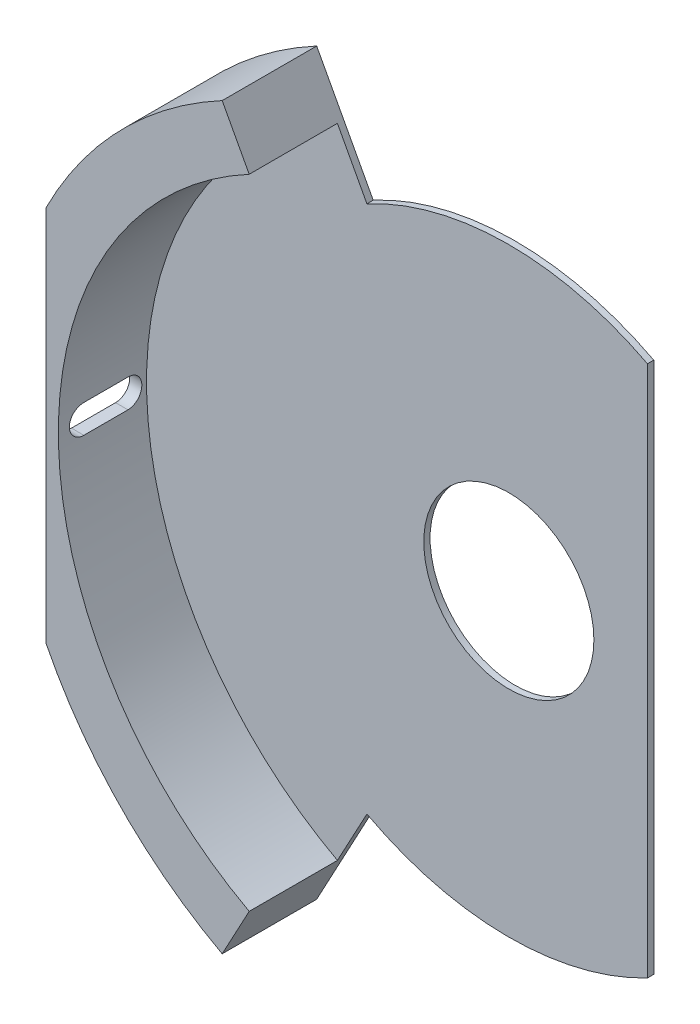
ISO-10303-21;
HEADER;
FILE_DESCRIPTION(('STEP AP214'),'2;1');
FILE_NAME('part.step','',(''),(''),'','','');
FILE_SCHEMA(('AUTOMOTIVE_DESIGN { 1 0 10303 214 1 1 1 1 }'));
ENDSEC;
DATA;
#1=APPLICATION_CONTEXT('core data for automotive mechanical design processes');
#2=APPLICATION_PROTOCOL_DEFINITION('international standard','automotive_design',2000,#1);
#3=PRODUCT_CONTEXT('',#1,'mechanical');
#4=PRODUCT('Part','Part','',(#3));
#5=PRODUCT_RELATED_PRODUCT_CATEGORY('part','',(#4));
#6=PRODUCT_DEFINITION_FORMATION('','',#4);
#7=PRODUCT_DEFINITION_CONTEXT('part definition',#1,'design');
#8=PRODUCT_DEFINITION('design','',#6,#7);
#9=PRODUCT_DEFINITION_SHAPE('','',#8);
#10=(LENGTH_UNIT() NAMED_UNIT(*) SI_UNIT(.MILLI.,.METRE.));
#11=(NAMED_UNIT(*) PLANE_ANGLE_UNIT() SI_UNIT($,.RADIAN.));
#12=(NAMED_UNIT(*) SI_UNIT($,.STERADIAN.) SOLID_ANGLE_UNIT());
#13=UNCERTAINTY_MEASURE_WITH_UNIT(LENGTH_MEASURE(1.E-05),#10,'distance_accuracy_value','');
#14=(GEOMETRIC_REPRESENTATION_CONTEXT(3) GLOBAL_UNCERTAINTY_ASSIGNED_CONTEXT((#13)) GLOBAL_UNIT_ASSIGNED_CONTEXT((#10,
#11,#12)) REPRESENTATION_CONTEXT('',''));
#15=CARTESIAN_POINT('',(0.,0.,0.));
#16=DIRECTION('',(0.,0.,1.));
#17=DIRECTION('',(1.,0.,0.));
#18=AXIS2_PLACEMENT_3D('',#15,#16,#17);
#19=CARTESIAN_POINT('',(0.,0.,1.));
#20=DIRECTION('',(0.,0.,1.));
#21=DIRECTION('',(1.,0.,0.));
#22=AXIS2_PLACEMENT_3D('',#19,#20,#21);
#23=PLANE('',#22);
#24=CARTESIAN_POINT('',(15.4943062439211,0.0942624622545622,1.));
#25=DIRECTION('',(0.,0.,1.));
#26=DIRECTION('',(1.,0.,0.));
#27=AXIS2_PLACEMENT_3D('',#24,#25,#26);
#28=CIRCLE('',#27,13.5);
#29=CARTESIAN_POINT('',(28.9943062439211,0.0942624622545622,1.));
#30=VERTEX_POINT('',#29);
#31=EDGE_CURVE('E277',#30,#30,#28,.T.);
#32=ORIENTED_EDGE('',*,*,#31,.F.);
#33=EDGE_LOOP('',(#32));
#34=FACE_BOUND('',#33,.T.);
#35=DIRECTION('',(0.473188405167526,-0.880961255229203,0.));
#36=VECTOR('',#35,1.);
#37=CARTESIAN_POINT('',(12.0643127935309,6.48007264374847,1.));
#38=LINE('',#37,#36);
#39=CARTESIAN_POINT('',(-11.7140270532117,50.7495346379337,1.));
#40=VERTEX_POINT('',#39);
#41=CARTESIAN_POINT('',(-7.03072274692771,42.0303657081212,1.));
#42=VERTEX_POINT('',#41);
#43=EDGE_CURVE('E303',#40,#42,#38,.T.);
#44=ORIENTED_EDGE('',*,*,#43,.F.);
#45=CARTESIAN_POINT('',(15.494306243921,0.0942624622545657,1.));
#46=DIRECTION('',(0.,0.,1.));
#47=DIRECTION('',(1.,0.,0.));
#48=AXIS2_PLACEMENT_3D('',#45,#46,#47);
#49=CIRCLE('',#48,57.5);
#50=CARTESIAN_POINT('',(-11.7140270532117,-50.5610097134247,1.));
#51=VERTEX_POINT('',#50);
#52=EDGE_CURVE('E189',#40,#51,#49,.T.);
#53=ORIENTED_EDGE('',*,*,#52,.T.);
#54=DIRECTION('',(0.473188405167525,0.880961255229204,0.));
#55=VECTOR('',#54,1.);
#56=CARTESIAN_POINT('',(11.9857241706994,-6.43786054318077,1.));
#57=LINE('',#56,#55);
#58=CARTESIAN_POINT('',(-7.0307227469277,-41.8418407836121,1.));
#59=VERTEX_POINT('',#58);
#60=EDGE_CURVE('E462',#51,#59,#57,.T.);
#61=ORIENTED_EDGE('',*,*,#60,.T.);
#62=CARTESIAN_POINT('',(15.4943062439211,0.0942624622545622,1.));
#63=DIRECTION('',(0.,0.,1.));
#64=DIRECTION('',(1.,0.,0.));
#65=AXIS2_PLACEMENT_3D('',#62,#63,#64);
#66=CIRCLE('',#65,47.6026646994321);
#67=CARTESIAN_POINT('',(37.494306243921,-42.1196414852195,1.));
#68=VERTEX_POINT('',#67);
#69=EDGE_CURVE('E478',#59,#68,#66,.T.);
#70=ORIENTED_EDGE('',*,*,#69,.T.);
#71=DIRECTION('',(0.,-1.,0.));
#72=VECTOR('',#71,1.);
#73=CARTESIAN_POINT('',(37.494306243921,0.,1.));
#74=LINE('',#73,#72);
#75=CARTESIAN_POINT('',(37.494306243921,42.3081664097286,1.));
#76=VERTEX_POINT('',#75);
#77=EDGE_CURVE('E361',#76,#68,#74,.T.);
#78=ORIENTED_EDGE('',*,*,#77,.F.);
#79=CARTESIAN_POINT('',(15.4943062439211,0.0942624622545622,1.));
#80=DIRECTION('',(0.,0.,1.));
#81=DIRECTION('',(1.,0.,0.));
#82=AXIS2_PLACEMENT_3D('',#79,#80,#81);
#83=CIRCLE('',#82,47.6026646994321);
#84=EDGE_CURVE('E292',#76,#42,#83,.T.);
#85=ORIENTED_EDGE('',*,*,#84,.T.);
#86=EDGE_LOOP('',(#44,#53,#61,#70,#78,#85));
#87=FACE_BOUND('',#86,.T.);
#88=ADVANCED_FACE('F35',(#34,#87),#23,.T.);
#89=CARTESIAN_POINT('',(0.,30.0942624622545,1.));
#90=DIRECTION('',(0.,1.,0.));
#91=DIRECTION('',(0.,0.,1.));
#92=AXIS2_PLACEMENT_3D('',#89,#90,#91);
#93=PLANE('',#92);
#94=DIRECTION('',(0.,0.,-1.));
#95=VECTOR('',#94,1.);
#96=CARTESIAN_POINT('',(-24.926493756079,30.0942624622545,1.));
#97=LINE('',#96,#95);
#98=CARTESIAN_POINT('',(-24.926493756079,30.0942624622545,0.));
#99=VERTEX_POINT('',#98);
#100=CARTESIAN_POINT('',(-24.926493756079,30.0942624622545,-7.));
#101=VERTEX_POINT('',#100);
#102=EDGE_CURVE('E11',#99,#101,#97,.T.);
#103=ORIENTED_EDGE('',*,*,#102,.F.);
#104=DIRECTION('',(1.,0.,0.));
#105=VECTOR('',#104,1.);
#106=CARTESIAN_POINT('',(0.,30.0942624622545,0.));
#107=LINE('',#106,#105);
#108=CARTESIAN_POINT('',(29.0043062439211,30.0942624622545,0.));
#109=VERTEX_POINT('',#108);
#110=EDGE_CURVE('E288',#99,#109,#107,.T.);
#111=ORIENTED_EDGE('',*,*,#110,.T.);
#112=DIRECTION('',(0.,0.,1.));
#113=VECTOR('',#112,1.);
#114=CARTESIAN_POINT('',(29.0043062439211,30.0942624622545,-7.));
#115=LINE('',#114,#113);
#116=CARTESIAN_POINT('',(29.0043062439211,30.0942624622545,-7.));
#117=VERTEX_POINT('',#116);
#118=EDGE_CURVE('E324',#117,#109,#115,.T.);
#119=ORIENTED_EDGE('',*,*,#118,.F.);
#120=DIRECTION('',(-1.,0.,0.));
#121=VECTOR('',#120,1.);
#122=CARTESIAN_POINT('',(0.,30.0942624622545,-7.));
#123=LINE('',#122,#121);
#124=EDGE_CURVE('E316',#117,#101,#123,.T.);
#125=ORIENTED_EDGE('',*,*,#124,.T.);
#126=EDGE_LOOP('',(#103,#111,#119,#125));
#127=FACE_BOUND('',#126,.T.);
#128=ADVANCED_FACE('F234',(#127),#93,.T.);
#129=CARTESIAN_POINT('',(-24.926493756079,0.,1.));
#130=DIRECTION('',(1.,0.,0.));
#131=DIRECTION('',(0.,0.,-1.));
#132=AXIS2_PLACEMENT_3D('',#129,#130,#131);
#133=PLANE('',#132);
#134=DIRECTION('',(0.,1.,0.));
#135=VECTOR('',#134,1.);
#136=CARTESIAN_POINT('',(-24.926493756079,0.,0.));
#137=LINE('',#136,#135);
#138=CARTESIAN_POINT('',(-24.926493756079,25.4942624622546,0.));
#139=VERTEX_POINT('',#138);
#140=EDGE_CURVE('E464',#139,#99,#137,.T.);
#141=ORIENTED_EDGE('',*,*,#140,.T.);
#142=ORIENTED_EDGE('',*,*,#102,.T.);
#143=DIRECTION('',(0.,-1.,0.));
#144=VECTOR('',#143,1.);
#145=CARTESIAN_POINT('',(-24.926493756079,0.,-7.));
#146=LINE('',#145,#144);
#147=CARTESIAN_POINT('',(-24.926493756079,25.4942624622546,-7.));
#148=VERTEX_POINT('',#147);
#149=EDGE_CURVE('E308',#101,#148,#146,.T.);
#150=ORIENTED_EDGE('',*,*,#149,.T.);
#151=DIRECTION('',(0.,0.,1.));
#152=VECTOR('',#151,1.);
#153=CARTESIAN_POINT('',(-24.926493756079,25.4942624622546,-7.));
#154=LINE('',#153,#152);
#155=EDGE_CURVE('E319',#148,#139,#154,.T.);
#156=ORIENTED_EDGE('',*,*,#155,.T.);
#157=EDGE_LOOP('',(#141,#142,#150,#156));
#158=FACE_BOUND('',#157,.T.);
#159=ADVANCED_FACE('F240',(#158),#133,.F.);
#160=CARTESIAN_POINT('',(-24.926493756079,-29.9057375377455,0.));
#161=VERTEX_POINT('',#160);
#162=CARTESIAN_POINT('',(-24.926493756079,-25.3057375377455,0.));
#163=VERTEX_POINT('',#162);
#164=EDGE_CURVE('E374',#161,#163,#137,.T.);
#165=ORIENTED_EDGE('',*,*,#164,.T.);
#166=DIRECTION('',(0.,0.,1.));
#167=VECTOR('',#166,1.);
#168=CARTESIAN_POINT('',(-24.926493756079,-25.3057375377455,-7.));
#169=LINE('',#168,#167);
#170=CARTESIAN_POINT('',(-24.926493756079,-25.3057375377455,-7.));
#171=VERTEX_POINT('',#170);
#172=EDGE_CURVE('E346',#171,#163,#169,.T.);
#173=ORIENTED_EDGE('',*,*,#172,.F.);
#174=DIRECTION('',(0.,-1.,0.));
#175=VECTOR('',#174,1.);
#176=CARTESIAN_POINT('',(-24.926493756079,0.,-7.));
#177=LINE('',#176,#175);
#178=CARTESIAN_POINT('',(-24.926493756079,-29.9057375377455,-7.));
#179=VERTEX_POINT('',#178);
#180=EDGE_CURVE('E336',#171,#179,#177,.T.);
#181=ORIENTED_EDGE('',*,*,#180,.T.);
#182=DIRECTION('',(0.,0.,-1.));
#183=VECTOR('',#182,1.);
#184=CARTESIAN_POINT('',(-24.926493756079,-29.9057375377455,1.));
#185=LINE('',#184,#183);
#186=EDGE_CURVE('E43',#161,#179,#185,.T.);
#187=ORIENTED_EDGE('',*,*,#186,.F.);
#188=EDGE_LOOP('',(#165,#173,#181,#187));
#189=FACE_BOUND('',#188,.T.);
#190=ADVANCED_FACE('F257',(#189),#133,.F.);
#191=CARTESIAN_POINT('',(0.,-29.9057375377455,1.));
#192=DIRECTION('',(0.,1.,0.));
#193=DIRECTION('',(0.,0.,1.));
#194=AXIS2_PLACEMENT_3D('',#191,#192,#193);
#195=PLANE('',#194);
#196=DIRECTION('',(-1.,0.,0.));
#197=VECTOR('',#196,1.);
#198=CARTESIAN_POINT('',(0.,-29.9057375377455,0.));
#199=LINE('',#198,#197);
#200=CARTESIAN_POINT('',(29.0043062439211,-29.9057375377455,0.));
#201=VERTEX_POINT('',#200);
#202=EDGE_CURVE('E368',#201,#161,#199,.T.);
#203=ORIENTED_EDGE('',*,*,#202,.T.);
#204=ORIENTED_EDGE('',*,*,#186,.T.);
#205=DIRECTION('',(1.,0.,0.));
#206=VECTOR('',#205,1.);
#207=CARTESIAN_POINT('',(0.,-29.9057375377455,-7.));
#208=LINE('',#207,#206);
#209=CARTESIAN_POINT('',(29.0043062439211,-29.9057375377455,-7.));
#210=VERTEX_POINT('',#209);
#211=EDGE_CURVE('E340',#179,#210,#208,.T.);
#212=ORIENTED_EDGE('',*,*,#211,.T.);
#213=DIRECTION('',(0.,0.,1.));
#214=VECTOR('',#213,1.);
#215=CARTESIAN_POINT('',(29.0043062439211,-29.9057375377455,-7.));
#216=LINE('',#215,#214);
#217=EDGE_CURVE('E354',#210,#201,#216,.T.);
#218=ORIENTED_EDGE('',*,*,#217,.T.);
#219=EDGE_LOOP('',(#203,#204,#212,#218));
#220=FACE_BOUND('',#219,.T.);
#221=ADVANCED_FACE('F253',(#220),#195,.F.);
#222=CARTESIAN_POINT('',(0.,0.,0.));
#223=DIRECTION('',(0.,0.,1.));
#224=DIRECTION('',(1.,0.,0.));
#225=AXIS2_PLACEMENT_3D('',#222,#223,#224);
#226=PLANE('',#225);
#227=CARTESIAN_POINT('',(15.4943062439211,0.0942624622545622,0.));
#228=DIRECTION('',(0.,0.,1.));
#229=DIRECTION('',(1.,0.,0.));
#230=AXIS2_PLACEMENT_3D('',#227,#228,#229);
#231=CIRCLE('',#230,47.6026646994321);
#232=CARTESIAN_POINT('',(-7.03072274692771,42.0303657081212,0.));
#233=VERTEX_POINT('',#232);
#234=CARTESIAN_POINT('',(37.494306243921,42.3081664097286,0.));
#235=VERTEX_POINT('',#234);
#236=EDGE_CURVE('E281',#233,#235,#231,.F.);
#237=ORIENTED_EDGE('',*,*,#236,.T.);
#238=DIRECTION('',(0.,-1.,0.));
#239=VECTOR('',#238,1.);
#240=CARTESIAN_POINT('',(37.494306243921,0.,0.));
#241=LINE('',#240,#239);
#242=CARTESIAN_POINT('',(37.494306243921,-42.1196414852195,0.));
#243=VERTEX_POINT('',#242);
#244=EDGE_CURVE('E269',#235,#243,#241,.T.);
#245=ORIENTED_EDGE('',*,*,#244,.T.);
#246=CARTESIAN_POINT('',(15.4943062439211,0.0942624622545622,0.));
#247=DIRECTION('',(0.,0.,1.));
#248=DIRECTION('',(1.,0.,0.));
#249=AXIS2_PLACEMENT_3D('',#246,#247,#248);
#250=CIRCLE('',#249,47.6026646994321);
#251=CARTESIAN_POINT('',(-7.0307227469277,-41.8418407836121,0.));
#252=VERTEX_POINT('',#251);
#253=EDGE_CURVE('E304',#243,#252,#250,.F.);
#254=ORIENTED_EDGE('',*,*,#253,.T.);
#255=DIRECTION('',(-0.473188405167525,-0.880961255229204,0.));
#256=VECTOR('',#255,1.);
#257=CARTESIAN_POINT('',(11.9857241706994,-6.43786054318077,0.));
#258=LINE('',#257,#256);
#259=CARTESIAN_POINT('',(-16.0032391306588,-58.5464751526176,0.));
#260=VERTEX_POINT('',#259);
#261=EDGE_CURVE('E307',#252,#260,#258,.T.);
#262=ORIENTED_EDGE('',*,*,#261,.T.);
#263=CARTESIAN_POINT('',(15.4943062439211,0.0942624622545622,0.));
#264=DIRECTION('',(0.,0.,1.));
#265=DIRECTION('',(1.,0.,0.));
#266=AXIS2_PLACEMENT_3D('',#263,#264,#265);
#267=CIRCLE('',#266,66.5644910792534);
#268=CARTESIAN_POINT('',(-43.926493756079,-29.9057375377455,0.));
#269=VERTEX_POINT('',#268);
#270=EDGE_CURVE('E473',#269,#260,#267,.T.);
#271=ORIENTED_EDGE('',*,*,#270,.F.);
#272=DIRECTION('',(0.,1.,0.));
#273=VECTOR('',#272,1.);
#274=CARTESIAN_POINT('',(-43.926493756079,0.,0.));
#275=LINE('',#274,#273);
#276=CARTESIAN_POINT('',(-43.926493756079,30.0942624622545,0.));
#277=VERTEX_POINT('',#276);
#278=EDGE_CURVE('E471',#269,#277,#275,.T.);
#279=ORIENTED_EDGE('',*,*,#278,.T.);
#280=CARTESIAN_POINT('',(15.4943062439211,0.0942624622545622,0.));
#281=DIRECTION('',(0.,0.,1.));
#282=DIRECTION('',(1.,0.,0.));
#283=AXIS2_PLACEMENT_3D('',#280,#281,#282);
#284=CIRCLE('',#283,66.5644910792534);
#285=CARTESIAN_POINT('',(-16.0032391306588,58.7350000771267,0.));
#286=VERTEX_POINT('',#285);
#287=EDGE_CURVE('E469',#277,#286,#284,.F.);
#288=ORIENTED_EDGE('',*,*,#287,.T.);
#289=DIRECTION('',(-0.473188405167526,0.880961255229203,0.));
#290=VECTOR('',#289,1.);
#291=CARTESIAN_POINT('',(12.0643127935309,6.48007264374847,0.));
#292=LINE('',#291,#290);
#293=EDGE_CURVE('E284',#233,#286,#292,.T.);
#294=ORIENTED_EDGE('',*,*,#293,.F.);
#295=EDGE_LOOP('',(#237,#245,#254,#262,#271,#279,#288,#294));
#296=FACE_BOUND('',#295,.T.);
#297=DIRECTION('',(-1.,0.,0.));
#298=VECTOR('',#297,1.);
#299=CARTESIAN_POINT('',(0.,-25.3057375377455,0.));
#300=LINE('',#299,#298);
#301=CARTESIAN_POINT('',(29.0043062439211,-25.3057375377454,0.));
#302=VERTEX_POINT('',#301);
#303=EDGE_CURVE('E327',#302,#163,#300,.T.);
#304=ORIENTED_EDGE('',*,*,#303,.T.);
#305=ORIENTED_EDGE('',*,*,#164,.F.);
#306=ORIENTED_EDGE('',*,*,#202,.F.);
#307=DIRECTION('',(0.,1.,0.));
#308=VECTOR('',#307,1.);
#309=CARTESIAN_POINT('',(29.0043062439211,0.,0.));
#310=LINE('',#309,#308);
#311=EDGE_CURVE('E337',#201,#302,#310,.T.);
#312=ORIENTED_EDGE('',*,*,#311,.T.);
#313=EDGE_LOOP('',(#304,#305,#306,#312));
#314=FACE_BOUND('',#313,.T.);
#315=CARTESIAN_POINT('',(15.4943062439211,0.0942624622545622,0.));
#316=DIRECTION('',(0.,0.,1.));
#317=DIRECTION('',(1.,0.,0.));
#318=AXIS2_PLACEMENT_3D('',#315,#316,#317);
#319=CIRCLE('',#318,13.5);
#320=CARTESIAN_POINT('',(28.9943062439211,0.0942624622545622,0.));
#321=VERTEX_POINT('',#320);
#322=EDGE_CURVE('E278',#321,#321,#319,.T.);
#323=ORIENTED_EDGE('',*,*,#322,.T.);
#324=EDGE_LOOP('',(#323));
#325=FACE_BOUND('',#324,.T.);
#326=DIRECTION('',(0.,-1.,0.));
#327=VECTOR('',#326,1.);
#328=CARTESIAN_POINT('',(29.0043062439211,0.,0.));
#329=LINE('',#328,#327);
#330=CARTESIAN_POINT('',(29.0043062439211,25.4942624622546,0.));
#331=VERTEX_POINT('',#330);
#332=EDGE_CURVE('E312',#109,#331,#329,.T.);
#333=ORIENTED_EDGE('',*,*,#332,.F.);
#334=ORIENTED_EDGE('',*,*,#110,.F.);
#335=ORIENTED_EDGE('',*,*,#140,.F.);
#336=DIRECTION('',(-1.,0.,0.));
#337=VECTOR('',#336,1.);
#338=CARTESIAN_POINT('',(0.,25.4942624622546,0.));
#339=LINE('',#338,#337);
#340=EDGE_CURVE('E306',#331,#139,#339,.T.);
#341=ORIENTED_EDGE('',*,*,#340,.F.);
#342=EDGE_LOOP('',(#333,#334,#335,#341));
#343=FACE_BOUND('',#342,.T.);
#344=ADVANCED_FACE('F249',(#296,#314,#325,#343),#226,.F.);
#345=CARTESIAN_POINT('',(37.494306243921,0.,1.));
#346=DIRECTION('',(1.,0.,0.));
#347=DIRECTION('',(0.,0.,-1.));
#348=AXIS2_PLACEMENT_3D('',#345,#346,#347);
#349=PLANE('',#348);
#350=ORIENTED_EDGE('',*,*,#244,.F.);
#351=DIRECTION('',(0.,0.,1.));
#352=VECTOR('',#351,1.);
#353=CARTESIAN_POINT('',(37.494306243921,42.3081664097286,-142.773565847131));
#354=LINE('',#353,#352);
#355=EDGE_CURVE('E272',#235,#76,#354,.T.);
#356=ORIENTED_EDGE('',*,*,#355,.T.);
#357=ORIENTED_EDGE('',*,*,#77,.T.);
#358=DIRECTION('',(0.,0.,1.));
#359=VECTOR('',#358,1.);
#360=CARTESIAN_POINT('',(37.494306243921,-42.1196414852195,-142.773565847131));
#361=LINE('',#360,#359);
#362=EDGE_CURVE('E275',#243,#68,#361,.T.);
#363=ORIENTED_EDGE('',*,*,#362,.F.);
#364=EDGE_LOOP('',(#350,#356,#357,#363));
#365=FACE_BOUND('',#364,.T.);
#366=ADVANCED_FACE('F252',(#365),#349,.T.);
#367=CARTESIAN_POINT('',(15.4943062439211,0.0942624622545622,1.));
#368=DIRECTION('',(0.,0.,-1.));
#369=DIRECTION('',(-1.,0.,0.));
#370=AXIS2_PLACEMENT_3D('',#367,#368,#369);
#371=CYLINDRICAL_SURFACE('',#370,13.5);
#372=ORIENTED_EDGE('',*,*,#31,.T.);
#373=EDGE_LOOP('',(#372));
#374=FACE_BOUND('',#373,.T.);
#375=ORIENTED_EDGE('',*,*,#322,.F.);
#376=EDGE_LOOP('',(#375));
#377=FACE_BOUND('',#376,.T.);
#378=ADVANCED_FACE('F37',(#374,#377),#371,.F.);
#379=CARTESIAN_POINT('',(0.,-25.3057375377455,-7.));
#380=DIRECTION('',(0.,1.,0.));
#381=DIRECTION('',(-1.,0.,0.));
#382=AXIS2_PLACEMENT_3D('',#379,#380,#381);
#383=PLANE('',#382);
#384=ORIENTED_EDGE('',*,*,#303,.F.);
#385=DIRECTION('',(0.,0.,1.));
#386=VECTOR('',#385,1.);
#387=CARTESIAN_POINT('',(29.0043062439211,-25.3057375377454,-7.));
#388=LINE('',#387,#386);
#389=CARTESIAN_POINT('',(29.0043062439211,-25.3057375377454,-7.));
#390=VERTEX_POINT('',#389);
#391=EDGE_CURVE('E351',#390,#302,#388,.T.);
#392=ORIENTED_EDGE('',*,*,#391,.F.);
#393=DIRECTION('',(-1.,0.,0.));
#394=VECTOR('',#393,1.);
#395=CARTESIAN_POINT('',(0.,-25.3057375377455,-7.));
#396=LINE('',#395,#394);
#397=EDGE_CURVE('E333',#390,#171,#396,.T.);
#398=ORIENTED_EDGE('',*,*,#397,.T.);
#399=ORIENTED_EDGE('',*,*,#172,.T.);
#400=EDGE_LOOP('',(#384,#392,#398,#399));
#401=FACE_BOUND('',#400,.T.);
#402=ADVANCED_FACE('F247',(#401),#383,.T.);
#403=CARTESIAN_POINT('',(29.0043062439211,0.,-7.));
#404=DIRECTION('',(1.,0.,0.));
#405=DIRECTION('',(0.,0.,-1.));
#406=AXIS2_PLACEMENT_3D('',#403,#404,#405);
#407=PLANE('',#406);
#408=ORIENTED_EDGE('',*,*,#311,.F.);
#409=ORIENTED_EDGE('',*,*,#217,.F.);
#410=DIRECTION('',(0.,1.,0.));
#411=VECTOR('',#410,1.);
#412=CARTESIAN_POINT('',(29.0043062439211,0.,-7.));
#413=LINE('',#412,#411);
#414=EDGE_CURVE('E343',#210,#390,#413,.T.);
#415=ORIENTED_EDGE('',*,*,#414,.T.);
#416=ORIENTED_EDGE('',*,*,#391,.T.);
#417=EDGE_LOOP('',(#408,#409,#415,#416));
#418=FACE_BOUND('',#417,.T.);
#419=ADVANCED_FACE('F379',(#418),#407,.T.);
#420=CARTESIAN_POINT('',(0.,0.,-7.));
#421=DIRECTION('',(0.,0.,1.));
#422=DIRECTION('',(1.,0.,0.));
#423=AXIS2_PLACEMENT_3D('',#420,#421,#422);
#424=PLANE('',#423);
#425=ORIENTED_EDGE('',*,*,#397,.F.);
#426=ORIENTED_EDGE('',*,*,#414,.F.);
#427=ORIENTED_EDGE('',*,*,#211,.F.);
#428=ORIENTED_EDGE('',*,*,#180,.F.);
#429=EDGE_LOOP('',(#425,#426,#427,#428));
#430=FACE_BOUND('',#429,.T.);
#431=ADVANCED_FACE('F373',(#430),#424,.F.);
#432=CARTESIAN_POINT('',(29.0043062439211,0.,-7.));
#433=DIRECTION('',(-1.,0.,0.));
#434=DIRECTION('',(0.,0.,1.));
#435=AXIS2_PLACEMENT_3D('',#432,#433,#434);
#436=PLANE('',#435);
#437=ORIENTED_EDGE('',*,*,#332,.T.);
#438=DIRECTION('',(0.,0.,1.));
#439=VECTOR('',#438,1.);
#440=CARTESIAN_POINT('',(29.0043062439211,25.4942624622546,-7.));
#441=LINE('',#440,#439);
#442=CARTESIAN_POINT('',(29.0043062439211,25.4942624622546,-7.));
#443=VERTEX_POINT('',#442);
#444=EDGE_CURVE('E328',#443,#331,#441,.T.);
#445=ORIENTED_EDGE('',*,*,#444,.F.);
#446=DIRECTION('',(0.,-1.,0.));
#447=VECTOR('',#446,1.);
#448=CARTESIAN_POINT('',(29.0043062439211,0.,-7.));
#449=LINE('',#448,#447);
#450=EDGE_CURVE('E314',#117,#443,#449,.T.);
#451=ORIENTED_EDGE('',*,*,#450,.F.);
#452=ORIENTED_EDGE('',*,*,#118,.T.);
#453=EDGE_LOOP('',(#437,#445,#451,#452));
#454=FACE_BOUND('',#453,.T.);
#455=ADVANCED_FACE('F385',(#454),#436,.F.);
#456=CARTESIAN_POINT('',(0.,25.4942624622546,-7.));
#457=DIRECTION('',(0.,1.,0.));
#458=DIRECTION('',(-1.,0.,0.));
#459=AXIS2_PLACEMENT_3D('',#456,#457,#458);
#460=PLANE('',#459);
#461=ORIENTED_EDGE('',*,*,#340,.T.);
#462=ORIENTED_EDGE('',*,*,#155,.F.);
#463=DIRECTION('',(-1.,0.,0.));
#464=VECTOR('',#463,1.);
#465=CARTESIAN_POINT('',(0.,25.4942624622546,-7.));
#466=LINE('',#465,#464);
#467=EDGE_CURVE('E311',#443,#148,#466,.T.);
#468=ORIENTED_EDGE('',*,*,#467,.F.);
#469=ORIENTED_EDGE('',*,*,#444,.T.);
#470=EDGE_LOOP('',(#461,#462,#468,#469));
#471=FACE_BOUND('',#470,.T.);
#472=ADVANCED_FACE('F388',(#471),#460,.F.);
#473=CARTESIAN_POINT('',(0.,0.,-7.));
#474=DIRECTION('',(0.,0.,-1.));
#475=DIRECTION('',(-1.,0.,0.));
#476=AXIS2_PLACEMENT_3D('',#473,#474,#475);
#477=PLANE('',#476);
#478=ORIENTED_EDGE('',*,*,#149,.F.);
#479=ORIENTED_EDGE('',*,*,#124,.F.);
#480=ORIENTED_EDGE('',*,*,#450,.T.);
#481=ORIENTED_EDGE('',*,*,#467,.T.);
#482=EDGE_LOOP('',(#478,#479,#480,#481));
#483=FACE_BOUND('',#482,.T.);
#484=ADVANCED_FACE('F391',(#483),#477,.T.);
#485=CARTESIAN_POINT('',(11.9857241706994,-6.43786054318077,-142.773565847131));
#486=DIRECTION('',(0.880961255229204,-0.473188405167525,0.));
#487=DIRECTION('',(0.473188405167525,0.880961255229204,0.));
#488=AXIS2_PLACEMENT_3D('',#485,#486,#487);
#489=PLANE('',#488);
#490=ORIENTED_EDGE('',*,*,#261,.F.);
#491=DIRECTION('',(0.,0.,1.));
#492=VECTOR('',#491,1.);
#493=CARTESIAN_POINT('',(-7.0307227469277,-41.8418407836121,-142.773565847131));
#494=LINE('',#493,#492);
#495=EDGE_CURVE('E297',#252,#59,#494,.T.);
#496=ORIENTED_EDGE('',*,*,#495,.T.);
#497=ORIENTED_EDGE('',*,*,#60,.F.);
#498=DIRECTION('',(0.,0.,-1.));
#499=VECTOR('',#498,1.);
#500=CARTESIAN_POINT('',(-11.7140270532117,-50.5610097134247,15.));
#501=LINE('',#500,#499);
#502=CARTESIAN_POINT('',(-11.7140270532117,-50.5610097134247,15.));
#503=VERTEX_POINT('',#502);
#504=EDGE_CURVE('E460',#503,#51,#501,.T.);
#505=ORIENTED_EDGE('',*,*,#504,.F.);
#506=DIRECTION('',(0.473188405167525,0.880961255229204,0.));
#507=VECTOR('',#506,1.);
#508=CARTESIAN_POINT('',(11.9857241706993,-6.43786054318075,15.));
#509=LINE('',#508,#507);
#510=CARTESIAN_POINT('',(-16.0032391306588,-58.5464751526176,15.));
#511=VERTEX_POINT('',#510);
#512=EDGE_CURVE('E452',#511,#503,#509,.T.);
#513=ORIENTED_EDGE('',*,*,#512,.F.);
#514=DIRECTION('',(0.,0.,1.));
#515=VECTOR('',#514,1.);
#516=CARTESIAN_POINT('',(-16.0032391306588,-58.5464751526176,-142.773565847131));
#517=LINE('',#516,#515);
#518=EDGE_CURVE('E465',#260,#511,#517,.T.);
#519=ORIENTED_EDGE('',*,*,#518,.F.);
#520=EDGE_LOOP('',(#490,#496,#497,#505,#513,#519));
#521=FACE_BOUND('',#520,.T.);
#522=ADVANCED_FACE('F398',(#521),#489,.T.);
#523=CARTESIAN_POINT('',(15.4943062439211,0.0942624622545622,-142.773565847131));
#524=DIRECTION('',(0.,0.,1.));
#525=DIRECTION('',(1.,0.,0.));
#526=AXIS2_PLACEMENT_3D('',#523,#524,#525);
#527=CYLINDRICAL_SURFACE('',#526,66.5644910792534);
#528=DIRECTION('',(0.,0.,1.));
#529=VECTOR('',#528,1.);
#530=CARTESIAN_POINT('',(-43.926493756079,-29.9057375377455,-142.773565847131));
#531=LINE('',#530,#529);
#532=CARTESIAN_POINT('',(-43.926493756079,-29.9057375377455,15.));
#533=VERTEX_POINT('',#532);
#534=EDGE_CURVE('E484',#269,#533,#531,.T.);
#535=ORIENTED_EDGE('',*,*,#534,.F.);
#536=ORIENTED_EDGE('',*,*,#270,.T.);
#537=ORIENTED_EDGE('',*,*,#518,.T.);
#538=CARTESIAN_POINT('',(15.494306243921,0.0942624622545657,15.));
#539=DIRECTION('',(0.,0.,1.));
#540=DIRECTION('',(1.,0.,0.));
#541=AXIS2_PLACEMENT_3D('',#538,#539,#540);
#542=CIRCLE('',#541,66.5644910792534);
#543=EDGE_CURVE('E446',#533,#511,#542,.T.);
#544=ORIENTED_EDGE('',*,*,#543,.F.);
#545=EDGE_LOOP('',(#535,#536,#537,#544));
#546=FACE_BOUND('',#545,.T.);
#547=ADVANCED_FACE('F402',(#546),#527,.T.);
#548=CARTESIAN_POINT('',(-43.926493756079,0.,-142.773565847131));
#549=DIRECTION('',(-1.,0.,0.));
#550=DIRECTION('',(0.,0.,1.));
#551=AXIS2_PLACEMENT_3D('',#548,#549,#550);
#552=PLANE('',#551);
#553=CARTESIAN_POINT('',(-43.926493756079,0.,4.));
#554=DIRECTION('',(-1.,0.,0.));
#555=DIRECTION('',(0.,0.,1.));
#556=AXIS2_PLACEMENT_3D('',#553,#554,#555);
#557=CIRCLE('',#556,2.25);
#558=CARTESIAN_POINT('',(-43.926493756079,2.25,4.));
#559=VERTEX_POINT('',#558);
#560=CARTESIAN_POINT('',(-43.926493756079,-2.25,4.));
#561=VERTEX_POINT('',#560);
#562=EDGE_CURVE('E50',#559,#561,#557,.T.);
#563=ORIENTED_EDGE('',*,*,#562,.F.);
#564=DIRECTION('',(0.,0.,-1.));
#565=VECTOR('',#564,1.);
#566=CARTESIAN_POINT('',(-43.926493756079,2.25,4.));
#567=LINE('',#566,#565);
#568=CARTESIAN_POINT('',(-43.926493756079,2.25,11.));
#569=VERTEX_POINT('',#568);
#570=EDGE_CURVE('E195',#569,#559,#567,.T.);
#571=ORIENTED_EDGE('',*,*,#570,.F.);
#572=CARTESIAN_POINT('',(-43.926493756079,0.,11.));
#573=DIRECTION('',(-1.,0.,0.));
#574=DIRECTION('',(0.,0.,1.));
#575=AXIS2_PLACEMENT_3D('',#572,#573,#574);
#576=CIRCLE('',#575,2.25);
#577=CARTESIAN_POINT('',(-43.926493756079,-2.25,11.));
#578=VERTEX_POINT('',#577);
#579=EDGE_CURVE('E518',#578,#569,#576,.T.);
#580=ORIENTED_EDGE('',*,*,#579,.F.);
#581=DIRECTION('',(0.,0.,1.));
#582=VECTOR('',#581,1.);
#583=CARTESIAN_POINT('',(-43.926493756079,-2.25,4.));
#584=LINE('',#583,#582);
#585=EDGE_CURVE('E202',#561,#578,#584,.T.);
#586=ORIENTED_EDGE('',*,*,#585,.F.);
#587=EDGE_LOOP('',(#563,#571,#580,#586));
#588=FACE_BOUND('',#587,.T.);
#589=ORIENTED_EDGE('',*,*,#278,.F.);
#590=ORIENTED_EDGE('',*,*,#534,.T.);
#591=DIRECTION('',(0.,-1.,0.));
#592=VECTOR('',#591,1.);
#593=CARTESIAN_POINT('',(-43.926493756079,0.,15.));
#594=LINE('',#593,#592);
#595=CARTESIAN_POINT('',(-43.926493756079,30.0942624622545,15.));
#596=VERTEX_POINT('',#595);
#597=EDGE_CURVE('E439',#596,#533,#594,.T.);
#598=ORIENTED_EDGE('',*,*,#597,.F.);
#599=DIRECTION('',(0.,0.,1.));
#600=VECTOR('',#599,1.);
#601=CARTESIAN_POINT('',(-43.926493756079,30.0942624622545,-142.773565847131));
#602=LINE('',#601,#600);
#603=EDGE_CURVE('E486',#277,#596,#602,.T.);
#604=ORIENTED_EDGE('',*,*,#603,.F.);
#605=EDGE_LOOP('',(#589,#590,#598,#604));
#606=FACE_BOUND('',#605,.T.);
#607=ADVANCED_FACE('F417',(#588,#606),#552,.T.);
#608=CARTESIAN_POINT('',(15.4943062439211,0.0942624622545622,-142.773565847131));
#609=DIRECTION('',(0.,0.,1.));
#610=DIRECTION('',(1.,0.,0.));
#611=AXIS2_PLACEMENT_3D('',#608,#609,#610);
#612=CYLINDRICAL_SURFACE('',#611,66.5644910792534);
#613=ORIENTED_EDGE('',*,*,#287,.F.);
#614=ORIENTED_EDGE('',*,*,#603,.T.);
#615=CARTESIAN_POINT('',(15.494306243921,0.0942624622545657,15.));
#616=DIRECTION('',(0.,0.,1.));
#617=DIRECTION('',(1.,0.,0.));
#618=AXIS2_PLACEMENT_3D('',#615,#616,#617);
#619=CIRCLE('',#618,66.5644910792534);
#620=CARTESIAN_POINT('',(-16.0032391306588,58.7350000771267,15.));
#621=VERTEX_POINT('',#620);
#622=EDGE_CURVE('E436',#596,#621,#619,.F.);
#623=ORIENTED_EDGE('',*,*,#622,.T.);
#624=DIRECTION('',(0.,0.,1.));
#625=VECTOR('',#624,1.);
#626=CARTESIAN_POINT('',(-16.0032391306588,58.7350000771267,-142.773565847131));
#627=LINE('',#626,#625);
#628=EDGE_CURVE('E295',#286,#621,#627,.T.);
#629=ORIENTED_EDGE('',*,*,#628,.F.);
#630=EDGE_LOOP('',(#613,#614,#623,#629));
#631=FACE_BOUND('',#630,.T.);
#632=ADVANCED_FACE('F413',(#631),#612,.T.);
#633=CARTESIAN_POINT('',(12.0643127935309,6.48007264374847,-142.773565847131));
#634=DIRECTION('',(-0.880961255229203,-0.473188405167526,0.));
#635=DIRECTION('',(0.473188405167526,-0.880961255229203,0.));
#636=AXIS2_PLACEMENT_3D('',#633,#634,#635);
#637=PLANE('',#636);
#638=DIRECTION('',(0.,0.,1.));
#639=VECTOR('',#638,1.);
#640=CARTESIAN_POINT('',(-7.03072274692771,42.0303657081212,-142.773565847131));
#641=LINE('',#640,#639);
#642=EDGE_CURVE('E293',#233,#42,#641,.T.);
#643=ORIENTED_EDGE('',*,*,#642,.F.);
#644=ORIENTED_EDGE('',*,*,#293,.T.);
#645=ORIENTED_EDGE('',*,*,#628,.T.);
#646=DIRECTION('',(0.473188405167526,-0.880961255229204,0.));
#647=VECTOR('',#646,1.);
#648=CARTESIAN_POINT('',(12.0643127935309,6.48007264374846,15.));
#649=LINE('',#648,#647);
#650=CARTESIAN_POINT('',(-11.7140270532117,50.7495346379337,15.));
#651=VERTEX_POINT('',#650);
#652=EDGE_CURVE('E443',#621,#651,#649,.T.);
#653=ORIENTED_EDGE('',*,*,#652,.T.);
#654=DIRECTION('',(0.,0.,-1.));
#655=VECTOR('',#654,1.);
#656=CARTESIAN_POINT('',(-11.7140270532117,50.7495346379337,15.));
#657=LINE('',#656,#655);
#658=EDGE_CURVE('E457',#651,#40,#657,.T.);
#659=ORIENTED_EDGE('',*,*,#658,.T.);
#660=ORIENTED_EDGE('',*,*,#43,.T.);
#661=EDGE_LOOP('',(#643,#644,#645,#653,#659,#660));
#662=FACE_BOUND('',#661,.T.);
#663=ADVANCED_FACE('F410',(#662),#637,.F.);
#664=CARTESIAN_POINT('',(15.4943062439211,0.0942624622545622,-142.773565847131));
#665=DIRECTION('',(0.,0.,1.));
#666=DIRECTION('',(1.,0.,0.));
#667=AXIS2_PLACEMENT_3D('',#664,#665,#666);
#668=CYLINDRICAL_SURFACE('',#667,47.6026646994321);
#669=ORIENTED_EDGE('',*,*,#236,.F.);
#670=ORIENTED_EDGE('',*,*,#642,.T.);
#671=ORIENTED_EDGE('',*,*,#84,.F.);
#672=ORIENTED_EDGE('',*,*,#355,.F.);
#673=EDGE_LOOP('',(#669,#670,#671,#672));
#674=FACE_BOUND('',#673,.T.);
#675=ADVANCED_FACE('F290',(#674),#668,.T.);
#676=CARTESIAN_POINT('',(15.4943062439211,0.0942624622545622,-142.773565847131));
#677=DIRECTION('',(0.,0.,1.));
#678=DIRECTION('',(1.,0.,0.));
#679=AXIS2_PLACEMENT_3D('',#676,#677,#678);
#680=CYLINDRICAL_SURFACE('',#679,47.6026646994321);
#681=ORIENTED_EDGE('',*,*,#253,.F.);
#682=ORIENTED_EDGE('',*,*,#362,.T.);
#683=ORIENTED_EDGE('',*,*,#69,.F.);
#684=ORIENTED_EDGE('',*,*,#495,.F.);
#685=EDGE_LOOP('',(#681,#682,#683,#684));
#686=FACE_BOUND('',#685,.T.);
#687=ADVANCED_FACE('F404',(#686),#680,.T.);
#688=CARTESIAN_POINT('',(15.494306243921,0.0942624622545657,15.));
#689=DIRECTION('',(0.,0.,-1.));
#690=DIRECTION('',(-1.,0.,0.));
#691=AXIS2_PLACEMENT_3D('',#688,#689,#690);
#692=CYLINDRICAL_SURFACE('',#691,57.5);
#693=CARTESIAN_POINT('',(-41.9652690735868,2.25,4.));
#694=CARTESIAN_POINT('',(-41.9652684857474,2.24999960631295,3.93672175849499));
#695=CARTESIAN_POINT('',(-41.9653693541219,2.24732890137259,3.87347385541096));
#696=CARTESIAN_POINT('',(-41.9657678282743,2.23667454563681,3.74743105520974));
#697=CARTESIAN_POINT('',(-41.9660654241118,2.2286911632814,3.68463613536618));
#698=CARTESIAN_POINT('',(-41.9672427797646,2.19684764822669,3.49771244616351));
#699=CARTESIAN_POINT('',(-41.9684071469265,2.16509393928211,3.374836520508));
#700=CARTESIAN_POINT('',(-41.9713611442365,2.08142205185451,3.13616987290625));
#701=CARTESIAN_POINT('',(-41.973151056606,2.02949477066771,3.02038237673594));
#702=CARTESIAN_POINT('',(-41.9771464836185,1.90695782605065,2.79917249488946));
#703=CARTESIAN_POINT('',(-41.9793519211161,1.83635162952282,2.69374819072694));
#704=CARTESIAN_POINT('',(-41.9839215670782,1.67841900683529,2.49620067443583));
#705=CARTESIAN_POINT('',(-41.9862858485216,1.59108486064051,2.40408363824793));
#706=CARTESIAN_POINT('',(-41.990894179801,1.40217732886121,2.23580007434167));
#707=CARTESIAN_POINT('',(-41.9931382113057,1.30060178076286,2.15963597341687));
#708=CARTESIAN_POINT('',(-41.9972392275488,1.08607587486411,2.02542369034658));
#709=CARTESIAN_POINT('',(-41.9990961256856,0.973122980316525,1.96737956019445));
#710=CARTESIAN_POINT('',(-42.0021971305156,0.739074147300515,1.87108454589797));
#711=CARTESIAN_POINT('',(-42.0034412783997,0.617978756816848,1.83283233127391));
#712=CARTESIAN_POINT('',(-42.0051594506155,0.371141176991651,1.77721986031147));
#713=CARTESIAN_POINT('',(-42.005633864002,0.24540136801865,1.75984905081573));
#714=CARTESIAN_POINT('',(-42.0057429244433,-0.00721303874147524,1.7464591128654));
#715=CARTESIAN_POINT('',(-42.0053775551374,-0.134087658588804,1.75044040039037));
#716=CARTESIAN_POINT('',(-42.003831071781,-0.385299033476655,1.77963370893234));
#717=CARTESIAN_POINT('',(-42.0026503747664,-0.509637052517249,1.80483487752904));
#718=CARTESIAN_POINT('',(-41.9995894526944,-0.752315117523146,1.87573498406956));
#719=CARTESIAN_POINT('',(-41.9977092283292,-0.870655169424299,1.92143390172748));
#720=CARTESIAN_POINT('',(-41.9934437222265,-1.09802637362381,2.03204994431111));
#721=CARTESIAN_POINT('',(-41.9910582589141,-1.20705415942233,2.09697398178537));
#722=CARTESIAN_POINT('',(-41.9860362391825,-1.41266186634588,2.24418905212879));
#723=CARTESIAN_POINT('',(-41.9833996937888,-1.50924233362056,2.32647932260346));
#724=CARTESIAN_POINT('',(-41.9781573425131,-1.6872772606368,2.50614597743204));
#725=CARTESIAN_POINT('',(-41.975551554353,-1.76872336393773,2.60353064205357));
#726=CARTESIAN_POINT('',(-41.9706538904829,-1.91413735434965,2.81063546375338));
#727=CARTESIAN_POINT('',(-41.9683621140463,-1.97809972038632,2.92035950199851));
#728=CARTESIAN_POINT('',(-41.9643420759419,-2.08672380651599,3.14904221900219));
#729=CARTESIAN_POINT('',(-41.9626141424603,-2.1313742909851,3.2680062262163));
#730=CARTESIAN_POINT('',(-41.9599152724931,-2.19999754520473,3.51165851681955));
#731=CARTESIAN_POINT('',(-41.9589431812135,-2.22400186464941,3.6363377584517));
#732=CARTESIAN_POINT('',(-41.9582291002068,-2.24158593620896,3.80154339405395));
#733=CARTESIAN_POINT('',(-41.9581006298401,-2.24474286273371,3.84120387080688));
#734=CARTESIAN_POINT('',(-41.9579293669878,-2.24894701744677,3.92057085475939));
#735=CARTESIAN_POINT('',(-41.9578864329444,-2.24999773131743,3.96027717691281));
#736=CARTESIAN_POINT('',(-41.9578863470329,-2.25,4.));
#737=B_SPLINE_CURVE_WITH_KNOTS('',3,(#693,#694,#695,#696,#697,#698,#699,#700,#701,#702,#703,
#704,#705,#706,#707,#708,#709,#710,#711,#712,#713,#714,#715,#716,#717,#718,#719,#720,#721,#722,
#723,#724,#725,#726,#727,#728,#729,#730,#731,#732,#733,#734,#735,#736),.UNSPECIFIED.,.F.,.F.,(4,
2,2,2,2,2,2,2,2,2,2,2,2,2,2,2,2,2,2,2,2,4),(0.,0.189718052779809,0.379426520176144,
0.758226730331311,1.13719806131591,1.51609910256775,1.89517543177902,2.27430938505214,
2.65352805974323,3.03272123875496,3.41172269839137,3.79073154172541,4.16954666734986,
4.54836141807497,4.92731254046181,5.30624702998614,5.68539013052807,6.06465282022033,
6.4441358685309,6.82303798793131,6.94235717788612,7.06147873665322),.UNSPECIFIED.);
#738=CARTESIAN_POINT('',(-41.9652690735868,2.25,4.));
#739=VERTEX_POINT('',#738);
#740=CARTESIAN_POINT('',(-41.9578863470329,-2.25,4.));
#741=VERTEX_POINT('',#740);
#742=EDGE_CURVE('E193',#739,#741,#737,.T.);
#743=ORIENTED_EDGE('',*,*,#742,.T.);
#744=DIRECTION('',(0.,0.,-1.));
#745=VECTOR('',#744,1.);
#746=CARTESIAN_POINT('',(-41.9578863470329,-2.25,15.));
#747=LINE('',#746,#745);
#748=CARTESIAN_POINT('',(-41.9578863470329,-2.25,11.));
#749=VERTEX_POINT('',#748);
#750=EDGE_CURVE('E182',#741,#749,#747,.F.);
#751=ORIENTED_EDGE('',*,*,#750,.T.);
#752=CARTESIAN_POINT('',(-41.9578863470329,-2.25,11.));
#753=CARTESIAN_POINT('',(-41.9578857602439,-2.24999961093536,11.0632732146498));
#754=CARTESIAN_POINT('',(-41.957995388137,-2.247329325496,11.1265160902852));
#755=CARTESIAN_POINT('',(-41.9584288055016,-2.23667667392223,11.252548807539));
#756=CARTESIAN_POINT('',(-41.958752584073,-2.22869457815482,11.3153386720511));
#757=CARTESIAN_POINT('',(-41.960034367764,-2.19685636824142,11.5022466113317));
#758=CARTESIAN_POINT('',(-41.9613028608811,-2.16510812233721,11.6251118464055));
#759=CARTESIAN_POINT('',(-41.9645311981112,-2.08145148624224,11.8637573601117));
#760=CARTESIAN_POINT('',(-41.9664913530232,-2.02953403193446,11.9795344261764));
#761=CARTESIAN_POINT('',(-41.9708884905029,-1.90702127629579,12.2007252623154));
#762=CARTESIAN_POINT('',(-41.9733253853036,-1.83642941205284,12.3061409345472));
#763=CARTESIAN_POINT('',(-41.9784129594381,-1.67852382098425,12.5036817961342));
#764=CARTESIAN_POINT('',(-41.9810637527591,-1.59120114374092,12.5957998252405));
#765=CARTESIAN_POINT('',(-41.9862918443326,-1.40231755984964,12.7640879364684));
#766=CARTESIAN_POINT('',(-41.988869131318,-1.30075448436845,12.8402555849096));
#767=CARTESIAN_POINT('',(-41.9936743012466,-1.086241182202,12.9744857811224));
#768=CARTESIAN_POINT('',(-41.9959020673454,-0.973287168179479,13.0325422807379));
#769=CARTESIAN_POINT('',(-41.9997714598411,-0.7392322572821,13.1288609943025));
#770=CARTESIAN_POINT('',(-42.0014131254937,-0.618131906675668,13.1671245340147));
#771=CARTESIAN_POINT('',(-42.0039414880516,-0.371277927943675,13.2227579453881));
#772=CARTESIAN_POINT('',(-42.0048285534945,-0.24552660264907,13.2401380180001));
#773=CARTESIAN_POINT('',(-42.0057664564644,0.00711490693630739,13.2535419732041));
#774=CARTESIAN_POINT('',(-42.005817278121,0.134005112795207,13.2495654504892));
#775=CARTESIAN_POINT('',(-42.0050946895966,0.385238718330699,13.2203770378987));
#776=CARTESIAN_POINT('',(-42.0043217764275,0.50958360764636,13.1951779548688));
#777=CARTESIAN_POINT('',(-42.0020567151566,0.752277072017108,13.1242789120439));
#778=CARTESIAN_POINT('',(-42.0005645682968,0.870625657424985,13.0785789876456));
#779=CARTESIAN_POINT('',(-41.9970448958687,1.09800072821869,12.967964000488));
#780=CARTESIAN_POINT('',(-41.9950172388698,1.20702491640336,12.9030442201124));
#781=CARTESIAN_POINT('',(-41.9906701108145,1.41262667739876,12.7558388782052));
#782=CARTESIAN_POINT('',(-41.9883506526481,1.50920479961839,12.6735540836437));
#783=CARTESIAN_POINT('',(-41.9836929893048,1.68723339310622,12.4939027646747));
#784=CARTESIAN_POINT('',(-41.9813547749909,1.7686759571631,12.3965284055237));
#785=CARTESIAN_POINT('',(-41.976934877807,1.9140854051407,12.1894469901435));
#786=CARTESIAN_POINT('',(-41.9748532761577,1.97804676383586,12.0797360501613));
#787=CARTESIAN_POINT('',(-41.971189945972,2.08667692336335,11.8510724256168));
#788=CARTESIAN_POINT('',(-41.9696085501606,2.13133288992107,11.7321136548713));
#789=CARTESIAN_POINT('',(-41.9671347572277,2.19996833450957,11.4884721986041));
#790=CARTESIAN_POINT('',(-41.9662413101369,2.22397932811466,11.3637985447211));
#791=CARTESIAN_POINT('',(-41.9655845516511,2.24157590066616,11.1985746977137));
#792=CARTESIAN_POINT('',(-41.9654663149933,2.24473659380601,11.15889066827));
#793=CARTESIAN_POINT('',(-41.9653086802501,2.24894576331424,11.0794764727949));
#794=CARTESIAN_POINT('',(-41.9652691518549,2.24999773091703,11.0397464921675));
#795=CARTESIAN_POINT('',(-41.9652690735868,2.25,11.));
#796=B_SPLINE_CURVE_WITH_KNOTS('',3,(#752,#753,#754,#755,#756,#757,#758,#759,#760,#761,#762,
#763,#764,#765,#766,#767,#768,#769,#770,#771,#772,#773,#774,#775,#776,#777,#778,#779,#780,#781,
#782,#783,#784,#785,#786,#787,#788,#789,#790,#791,#792,#793,#794,#795),.UNSPECIFIED.,.F.,.F.,(4,
2,2,2,2,2,2,2,2,2,2,2,2,2,2,2,2,2,2,2,2,4),(0.,0.189702971464567,0.379396287934203,
0.758164455545909,1.13710304025548,1.51597192851086,1.89504406756686,2.27417400269568,
2.65343041176799,3.03266141436752,3.41170709852939,3.79075997627141,4.1695842766783,
4.54840792301187,4.92732463083415,5.30622460633494,5.685321976031,6.06453902755043,
6.44400779730886,6.8228962554555,6.94228660692233,7.06147913031652),.UNSPECIFIED.);
#797=CARTESIAN_POINT('',(-41.9652690735868,2.25,11.));
#798=VERTEX_POINT('',#797);
#799=EDGE_CURVE('E204',#749,#798,#796,.T.);
#800=ORIENTED_EDGE('',*,*,#799,.T.);
#801=DIRECTION('',(0.,0.,-1.));
#802=VECTOR('',#801,1.);
#803=CARTESIAN_POINT('',(-41.9652690735868,2.25,15.));
#804=LINE('',#803,#802);
#805=EDGE_CURVE('E200',#798,#739,#804,.T.);
#806=ORIENTED_EDGE('',*,*,#805,.T.);
#807=EDGE_LOOP('',(#743,#751,#800,#806));
#808=FACE_BOUND('',#807,.T.);
#809=ORIENTED_EDGE('',*,*,#52,.F.);
#810=ORIENTED_EDGE('',*,*,#658,.F.);
#811=CARTESIAN_POINT('',(15.494306243921,0.0942624622545657,15.));
#812=DIRECTION('',(0.,0.,1.));
#813=DIRECTION('',(1.,0.,0.));
#814=AXIS2_PLACEMENT_3D('',#811,#812,#813);
#815=CIRCLE('',#814,57.5);
#816=EDGE_CURVE('E454',#651,#503,#815,.T.);
#817=ORIENTED_EDGE('',*,*,#816,.T.);
#818=ORIENTED_EDGE('',*,*,#504,.T.);
#819=EDGE_LOOP('',(#809,#810,#817,#818));
#820=FACE_BOUND('',#819,.T.);
#821=ADVANCED_FACE('F198',(#808,#820),#692,.F.);
#822=CARTESIAN_POINT('',(0.,0.,15.));
#823=DIRECTION('',(0.,0.,1.));
#824=DIRECTION('',(1.,0.,0.));
#825=AXIS2_PLACEMENT_3D('',#822,#823,#824);
#826=PLANE('',#825);
#827=ORIENTED_EDGE('',*,*,#622,.F.);
#828=ORIENTED_EDGE('',*,*,#597,.T.);
#829=ORIENTED_EDGE('',*,*,#543,.T.);
#830=ORIENTED_EDGE('',*,*,#512,.T.);
#831=ORIENTED_EDGE('',*,*,#816,.F.);
#832=ORIENTED_EDGE('',*,*,#652,.F.);
#833=EDGE_LOOP('',(#827,#828,#829,#830,#831,#832));
#834=FACE_BOUND('',#833,.T.);
#835=ADVANCED_FACE('F426',(#834),#826,.T.);
#836=CARTESIAN_POINT('',(37.495306243921,0.,4.));
#837=DIRECTION('',(-1.,0.,0.));
#838=DIRECTION('',(0.,0.,1.));
#839=AXIS2_PLACEMENT_3D('',#836,#837,#838);
#840=CYLINDRICAL_SURFACE('',#839,2.25);
#841=DIRECTION('',(-1.,0.,0.));
#842=VECTOR('',#841,1.);
#843=CARTESIAN_POINT('',(37.495306243921,2.25,4.));
#844=LINE('',#843,#842);
#845=EDGE_CURVE('E190',#739,#559,#844,.T.);
#846=ORIENTED_EDGE('',*,*,#845,.T.);
#847=ORIENTED_EDGE('',*,*,#562,.T.);
#848=DIRECTION('',(-1.,0.,0.));
#849=VECTOR('',#848,1.);
#850=CARTESIAN_POINT('',(37.495306243921,-2.25,4.));
#851=LINE('',#850,#849);
#852=EDGE_CURVE('E184',#741,#561,#851,.T.);
#853=ORIENTED_EDGE('',*,*,#852,.F.);
#854=ORIENTED_EDGE('',*,*,#742,.F.);
#855=EDGE_LOOP('',(#846,#847,#853,#854));
#856=FACE_BOUND('',#855,.T.);
#857=ADVANCED_FACE('F192',(#856),#840,.F.);
#858=CARTESIAN_POINT('',(37.495306243921,2.25,4.));
#859=DIRECTION('',(0.,1.,0.));
#860=DIRECTION('',(0.,0.,1.));
#861=AXIS2_PLACEMENT_3D('',#858,#859,#860);
#862=PLANE('',#861);
#863=DIRECTION('',(-1.,0.,0.));
#864=VECTOR('',#863,1.);
#865=CARTESIAN_POINT('',(37.495306243921,2.25,11.));
#866=LINE('',#865,#864);
#867=EDGE_CURVE('E513',#798,#569,#866,.T.);
#868=ORIENTED_EDGE('',*,*,#867,.T.);
#869=ORIENTED_EDGE('',*,*,#570,.T.);
#870=ORIENTED_EDGE('',*,*,#845,.F.);
#871=ORIENTED_EDGE('',*,*,#805,.F.);
#872=EDGE_LOOP('',(#868,#869,#870,#871));
#873=FACE_BOUND('',#872,.T.);
#874=ADVANCED_FACE('F219',(#873),#862,.F.);
#875=CARTESIAN_POINT('',(37.495306243921,0.,11.));
#876=DIRECTION('',(-1.,0.,0.));
#877=DIRECTION('',(0.,0.,1.));
#878=AXIS2_PLACEMENT_3D('',#875,#876,#877);
#879=CYLINDRICAL_SURFACE('',#878,2.25);
#880=DIRECTION('',(-1.,0.,0.));
#881=VECTOR('',#880,1.);
#882=CARTESIAN_POINT('',(37.495306243921,-2.25,11.));
#883=LINE('',#882,#881);
#884=EDGE_CURVE('E58',#749,#578,#883,.T.);
#885=ORIENTED_EDGE('',*,*,#884,.T.);
#886=ORIENTED_EDGE('',*,*,#579,.T.);
#887=ORIENTED_EDGE('',*,*,#867,.F.);
#888=ORIENTED_EDGE('',*,*,#799,.F.);
#889=EDGE_LOOP('',(#885,#886,#887,#888));
#890=FACE_BOUND('',#889,.T.);
#891=ADVANCED_FACE('F226',(#890),#879,.F.);
#892=CARTESIAN_POINT('',(37.495306243921,-2.25,4.));
#893=DIRECTION('',(0.,-1.,0.));
#894=DIRECTION('',(0.,0.,-1.));
#895=AXIS2_PLACEMENT_3D('',#892,#893,#894);
#896=PLANE('',#895);
#897=ORIENTED_EDGE('',*,*,#852,.T.);
#898=ORIENTED_EDGE('',*,*,#585,.T.);
#899=ORIENTED_EDGE('',*,*,#884,.F.);
#900=ORIENTED_EDGE('',*,*,#750,.F.);
#901=EDGE_LOOP('',(#897,#898,#899,#900));
#902=FACE_BOUND('',#901,.T.);
#903=ADVANCED_FACE('F183',(#902),#896,.F.);
#904=CLOSED_SHELL('',(#88,#128,#159,#190,#221,#344,#366,#378,#402,#419,#431,#455,#472,#484,#522,
#547,#607,#632,#663,#675,#687,#821,#835,#857,#874,#891,#903));
#905=MANIFOLD_SOLID_BREP('B2',#904);
#906=ADVANCED_BREP_SHAPE_REPRESENTATION('',(#18,#905),#14);
#907=SHAPE_DEFINITION_REPRESENTATION(#9,#906);
ENDSEC;
END-ISO-10303-21;
